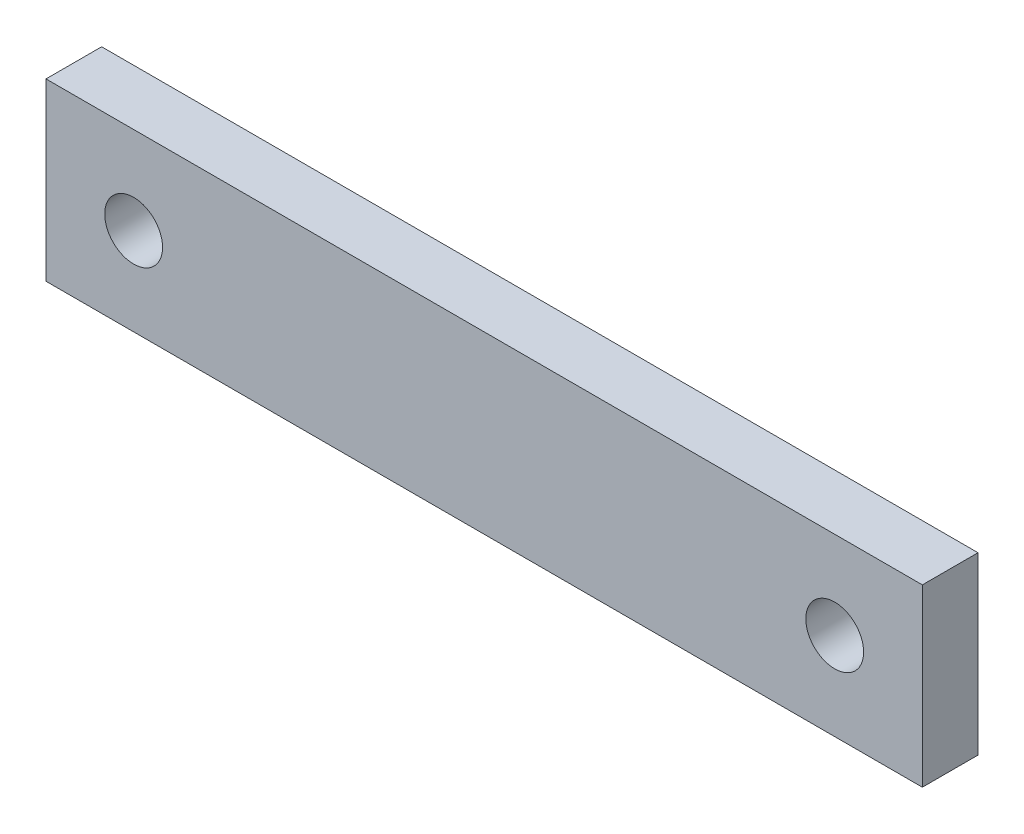
ISO-10303-21;
HEADER;
FILE_DESCRIPTION(('STEP AP214'),'2;1');
FILE_NAME('part.step','',(''),(''),'','','');
FILE_SCHEMA(('AUTOMOTIVE_DESIGN { 1 0 10303 214 1 1 1 1 }'));
ENDSEC;
DATA;
#1=APPLICATION_CONTEXT('core data for automotive mechanical design processes');
#2=APPLICATION_PROTOCOL_DEFINITION('international standard','automotive_design',2000,#1);
#3=PRODUCT_CONTEXT('',#1,'mechanical');
#4=PRODUCT('Part','Part','',(#3));
#5=PRODUCT_RELATED_PRODUCT_CATEGORY('part','',(#4));
#6=PRODUCT_DEFINITION_FORMATION('','',#4);
#7=PRODUCT_DEFINITION_CONTEXT('part definition',#1,'design');
#8=PRODUCT_DEFINITION('design','',#6,#7);
#9=PRODUCT_DEFINITION_SHAPE('','',#8);
#10=(LENGTH_UNIT() NAMED_UNIT(*) SI_UNIT(.MILLI.,.METRE.));
#11=(NAMED_UNIT(*) PLANE_ANGLE_UNIT() SI_UNIT($,.RADIAN.));
#12=(NAMED_UNIT(*) SI_UNIT($,.STERADIAN.) SOLID_ANGLE_UNIT());
#13=UNCERTAINTY_MEASURE_WITH_UNIT(LENGTH_MEASURE(1.E-05),#10,'distance_accuracy_value','');
#14=(GEOMETRIC_REPRESENTATION_CONTEXT(3) GLOBAL_UNCERTAINTY_ASSIGNED_CONTEXT((#13)) GLOBAL_UNIT_ASSIGNED_CONTEXT((#10,
#11,#12)) REPRESENTATION_CONTEXT('',''));
#15=CARTESIAN_POINT('',(0.,0.,0.));
#16=DIRECTION('',(0.,0.,1.));
#17=DIRECTION('',(1.,0.,0.));
#18=AXIS2_PLACEMENT_3D('',#15,#16,#17);
#19=CARTESIAN_POINT('',(0.,0.,3.175));
#20=DIRECTION('',(0.,0.,1.));
#21=DIRECTION('',(1.,0.,0.));
#22=AXIS2_PLACEMENT_3D('',#19,#20,#21);
#23=PLANE('',#22);
#24=CARTESIAN_POINT('',(-40.,0.,3.175));
#25=DIRECTION('',(0.,0.,1.));
#26=DIRECTION('',(1.,0.,0.));
#27=AXIS2_PLACEMENT_3D('',#24,#25,#26);
#28=CIRCLE('',#27,3.29999999999999);
#29=CARTESIAN_POINT('',(-36.7,0.,3.175));
#30=VERTEX_POINT('',#29);
#31=EDGE_CURVE('E114',#30,#30,#28,.T.);
#32=ORIENTED_EDGE('',*,*,#31,.F.);
#33=EDGE_LOOP('',(#32));
#34=FACE_BOUND('',#33,.T.);
#35=DIRECTION('',(0.,-1.,0.));
#36=VECTOR('',#35,1.);
#37=CARTESIAN_POINT('',(-50.,-10.,3.175));
#38=LINE('',#37,#36);
#39=CARTESIAN_POINT('',(-50.,10.,3.175));
#40=VERTEX_POINT('',#39);
#41=CARTESIAN_POINT('',(-50.,-10.,3.175));
#42=VERTEX_POINT('',#41);
#43=EDGE_CURVE('E94',#40,#42,#38,.T.);
#44=ORIENTED_EDGE('',*,*,#43,.T.);
#45=DIRECTION('',(1.,0.,0.));
#46=VECTOR('',#45,1.);
#47=CARTESIAN_POINT('',(50.,-10.,3.175));
#48=LINE('',#47,#46);
#49=CARTESIAN_POINT('',(50.,-10.,3.175));
#50=VERTEX_POINT('',#49);
#51=EDGE_CURVE('E88',#42,#50,#48,.T.);
#52=ORIENTED_EDGE('',*,*,#51,.T.);
#53=DIRECTION('',(0.,1.,0.));
#54=VECTOR('',#53,1.);
#55=CARTESIAN_POINT('',(50.,-10.,3.175));
#56=LINE('',#55,#54);
#57=CARTESIAN_POINT('',(50.,10.,3.175));
#58=VERTEX_POINT('',#57);
#59=EDGE_CURVE('E92',#50,#58,#56,.T.);
#60=ORIENTED_EDGE('',*,*,#59,.T.);
#61=DIRECTION('',(-1.,0.,0.));
#62=VECTOR('',#61,1.);
#63=CARTESIAN_POINT('',(50.,10.,3.175));
#64=LINE('',#63,#62);
#65=EDGE_CURVE('E57',#58,#40,#64,.T.);
#66=ORIENTED_EDGE('',*,*,#65,.T.);
#67=EDGE_LOOP('',(#44,#52,#60,#66));
#68=FACE_BOUND('',#67,.T.);
#69=CARTESIAN_POINT('',(40.,0.,3.175));
#70=DIRECTION('',(0.,0.,1.));
#71=DIRECTION('',(-1.,0.,0.));
#72=AXIS2_PLACEMENT_3D('',#69,#70,#71);
#73=CIRCLE('',#72,3.29999999999999);
#74=CARTESIAN_POINT('',(36.7,0.,3.175));
#75=VERTEX_POINT('',#74);
#76=EDGE_CURVE('E132',#75,#75,#73,.T.);
#77=ORIENTED_EDGE('',*,*,#76,.F.);
#78=EDGE_LOOP('',(#77));
#79=FACE_BOUND('',#78,.T.);
#80=ADVANCED_FACE('F40',(#34,#68,#79),#23,.T.);
#81=CARTESIAN_POINT('',(0.,0.,-3.175));
#82=DIRECTION('',(0.,0.,1.));
#83=DIRECTION('',(1.,0.,0.));
#84=AXIS2_PLACEMENT_3D('',#81,#82,#83);
#85=PLANE('',#84);
#86=CARTESIAN_POINT('',(-40.,0.,-3.175));
#87=DIRECTION('',(0.,0.,1.));
#88=DIRECTION('',(1.,0.,0.));
#89=AXIS2_PLACEMENT_3D('',#86,#87,#88);
#90=CIRCLE('',#89,3.29999999999999);
#91=CARTESIAN_POINT('',(-36.7,0.,-3.175));
#92=VERTEX_POINT('',#91);
#93=EDGE_CURVE('E129',#92,#92,#90,.T.);
#94=ORIENTED_EDGE('',*,*,#93,.T.);
#95=EDGE_LOOP('',(#94));
#96=FACE_BOUND('',#95,.T.);
#97=DIRECTION('',(0.,-1.,0.));
#98=VECTOR('',#97,1.);
#99=CARTESIAN_POINT('',(-50.,-10.,-3.175));
#100=LINE('',#99,#98);
#101=CARTESIAN_POINT('',(-50.,10.,-3.175));
#102=VERTEX_POINT('',#101);
#103=CARTESIAN_POINT('',(-50.,-10.,-3.175));
#104=VERTEX_POINT('',#103);
#105=EDGE_CURVE('E111',#102,#104,#100,.T.);
#106=ORIENTED_EDGE('',*,*,#105,.F.);
#107=DIRECTION('',(-1.,0.,0.));
#108=VECTOR('',#107,1.);
#109=CARTESIAN_POINT('',(50.,10.,-3.175));
#110=LINE('',#109,#108);
#111=CARTESIAN_POINT('',(50.,10.,-3.175));
#112=VERTEX_POINT('',#111);
#113=EDGE_CURVE('E81',#112,#102,#110,.T.);
#114=ORIENTED_EDGE('',*,*,#113,.F.);
#115=DIRECTION('',(0.,1.,0.));
#116=VECTOR('',#115,1.);
#117=CARTESIAN_POINT('',(50.,-10.,-3.175));
#118=LINE('',#117,#116);
#119=CARTESIAN_POINT('',(50.,-10.,-3.175));
#120=VERTEX_POINT('',#119);
#121=EDGE_CURVE('E75',#120,#112,#118,.T.);
#122=ORIENTED_EDGE('',*,*,#121,.F.);
#123=DIRECTION('',(1.,0.,0.));
#124=VECTOR('',#123,1.);
#125=CARTESIAN_POINT('',(50.,-10.,-3.175));
#126=LINE('',#125,#124);
#127=EDGE_CURVE('E99',#104,#120,#126,.T.);
#128=ORIENTED_EDGE('',*,*,#127,.F.);
#129=EDGE_LOOP('',(#106,#114,#122,#128));
#130=FACE_BOUND('',#129,.T.);
#131=CARTESIAN_POINT('',(40.,0.,-3.175));
#132=DIRECTION('',(0.,0.,1.));
#133=DIRECTION('',(-1.,0.,0.));
#134=AXIS2_PLACEMENT_3D('',#131,#132,#133);
#135=CIRCLE('',#134,3.29999999999999);
#136=CARTESIAN_POINT('',(36.7,0.,-3.175));
#137=VERTEX_POINT('',#136);
#138=EDGE_CURVE('E135',#137,#137,#135,.T.);
#139=ORIENTED_EDGE('',*,*,#138,.T.);
#140=EDGE_LOOP('',(#139));
#141=FACE_BOUND('',#140,.T.);
#142=ADVANCED_FACE('F125',(#96,#130,#141),#85,.F.);
#143=CARTESIAN_POINT('',(-50.,-10.,3.175));
#144=DIRECTION('',(1.,0.,0.));
#145=DIRECTION('',(0.,0.,-1.));
#146=AXIS2_PLACEMENT_3D('',#143,#144,#145);
#147=PLANE('',#146);
#148=ORIENTED_EDGE('',*,*,#105,.T.);
#149=DIRECTION('',(0.,0.,-1.));
#150=VECTOR('',#149,1.);
#151=CARTESIAN_POINT('',(-50.,-10.,3.175));
#152=LINE('',#151,#150);
#153=EDGE_CURVE('E11',#42,#104,#152,.T.);
#154=ORIENTED_EDGE('',*,*,#153,.F.);
#155=ORIENTED_EDGE('',*,*,#43,.F.);
#156=DIRECTION('',(0.,0.,-1.));
#157=VECTOR('',#156,1.);
#158=CARTESIAN_POINT('',(-50.,10.,3.175));
#159=LINE('',#158,#157);
#160=EDGE_CURVE('E107',#40,#102,#159,.T.);
#161=ORIENTED_EDGE('',*,*,#160,.T.);
#162=EDGE_LOOP('',(#148,#154,#155,#161));
#163=FACE_BOUND('',#162,.T.);
#164=ADVANCED_FACE('F42',(#163),#147,.F.);
#165=CARTESIAN_POINT('',(50.,-10.,3.175));
#166=DIRECTION('',(0.,1.,0.));
#167=DIRECTION('',(0.,0.,1.));
#168=AXIS2_PLACEMENT_3D('',#165,#166,#167);
#169=PLANE('',#168);
#170=ORIENTED_EDGE('',*,*,#127,.T.);
#171=DIRECTION('',(0.,0.,-1.));
#172=VECTOR('',#171,1.);
#173=CARTESIAN_POINT('',(50.,-10.,3.175));
#174=LINE('',#173,#172);
#175=EDGE_CURVE('E49',#50,#120,#174,.T.);
#176=ORIENTED_EDGE('',*,*,#175,.F.);
#177=ORIENTED_EDGE('',*,*,#51,.F.);
#178=ORIENTED_EDGE('',*,*,#153,.T.);
#179=EDGE_LOOP('',(#170,#176,#177,#178));
#180=FACE_BOUND('',#179,.T.);
#181=ADVANCED_FACE('F98',(#180),#169,.F.);
#182=CARTESIAN_POINT('',(50.,-10.,3.175));
#183=DIRECTION('',(-1.,0.,0.));
#184=DIRECTION('',(0.,0.,1.));
#185=AXIS2_PLACEMENT_3D('',#182,#183,#184);
#186=PLANE('',#185);
#187=ORIENTED_EDGE('',*,*,#121,.T.);
#188=DIRECTION('',(0.,0.,-1.));
#189=VECTOR('',#188,1.);
#190=CARTESIAN_POINT('',(50.,10.,3.175));
#191=LINE('',#190,#189);
#192=EDGE_CURVE('E101',#58,#112,#191,.T.);
#193=ORIENTED_EDGE('',*,*,#192,.F.);
#194=ORIENTED_EDGE('',*,*,#59,.F.);
#195=ORIENTED_EDGE('',*,*,#175,.T.);
#196=EDGE_LOOP('',(#187,#193,#194,#195));
#197=FACE_BOUND('',#196,.T.);
#198=ADVANCED_FACE('F102',(#197),#186,.F.);
#199=CARTESIAN_POINT('',(50.,10.,3.175));
#200=DIRECTION('',(0.,-1.,0.));
#201=DIRECTION('',(0.,0.,-1.));
#202=AXIS2_PLACEMENT_3D('',#199,#200,#201);
#203=PLANE('',#202);
#204=ORIENTED_EDGE('',*,*,#113,.T.);
#205=ORIENTED_EDGE('',*,*,#160,.F.);
#206=ORIENTED_EDGE('',*,*,#65,.F.);
#207=ORIENTED_EDGE('',*,*,#192,.T.);
#208=EDGE_LOOP('',(#204,#205,#206,#207));
#209=FACE_BOUND('',#208,.T.);
#210=ADVANCED_FACE('F122',(#209),#203,.F.);
#211=CARTESIAN_POINT('',(-40.,0.,3.175));
#212=DIRECTION('',(0.,0.,-1.));
#213=DIRECTION('',(-1.,0.,0.));
#214=AXIS2_PLACEMENT_3D('',#211,#212,#213);
#215=CYLINDRICAL_SURFACE('',#214,3.29999999999999);
#216=ORIENTED_EDGE('',*,*,#31,.T.);
#217=EDGE_LOOP('',(#216));
#218=FACE_BOUND('',#217,.T.);
#219=ORIENTED_EDGE('',*,*,#93,.F.);
#220=EDGE_LOOP('',(#219));
#221=FACE_BOUND('',#220,.T.);
#222=ADVANCED_FACE('F154',(#218,#221),#215,.F.);
#223=CARTESIAN_POINT('',(40.,0.,3.175));
#224=DIRECTION('',(0.,0.,-1.));
#225=DIRECTION('',(-1.,0.,0.));
#226=AXIS2_PLACEMENT_3D('',#223,#224,#225);
#227=CYLINDRICAL_SURFACE('',#226,3.29999999999999);
#228=ORIENTED_EDGE('',*,*,#76,.T.);
#229=EDGE_LOOP('',(#228));
#230=FACE_BOUND('',#229,.T.);
#231=ORIENTED_EDGE('',*,*,#138,.F.);
#232=EDGE_LOOP('',(#231));
#233=FACE_BOUND('',#232,.T.);
#234=ADVANCED_FACE('F142',(#230,#233),#227,.F.);
#235=CLOSED_SHELL('',(#80,#142,#164,#181,#198,#210,#222,#234));
#236=MANIFOLD_SOLID_BREP('B2',#235);
#237=ADVANCED_BREP_SHAPE_REPRESENTATION('',(#18,#236),#14);
#238=SHAPE_DEFINITION_REPRESENTATION(#9,#237);
ENDSEC;
END-ISO-10303-21;
